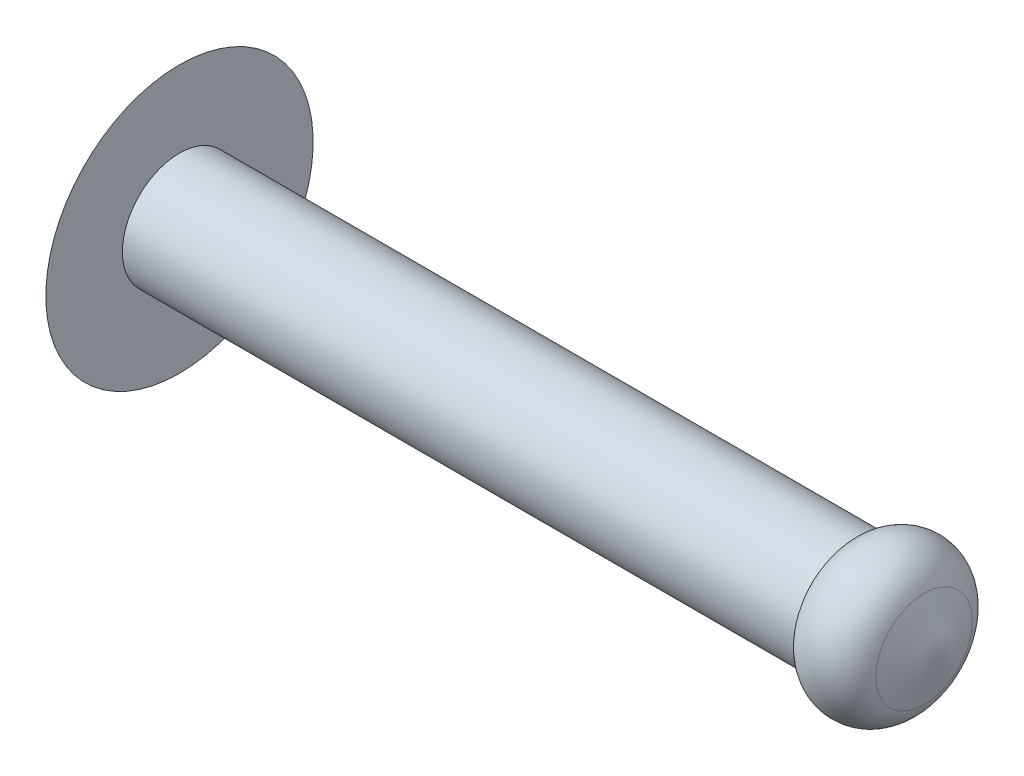
ISO-10303-21;
HEADER;
FILE_DESCRIPTION(('STEP AP214'),'2;1');
FILE_NAME('part.step','',(''),(''),'','','');
FILE_SCHEMA(('AUTOMOTIVE_DESIGN { 1 0 10303 214 1 1 1 1 }'));
ENDSEC;
DATA;
#1=APPLICATION_CONTEXT('core data for automotive mechanical design processes');
#2=APPLICATION_PROTOCOL_DEFINITION('international standard','automotive_design',2000,#1);
#3=PRODUCT_CONTEXT('',#1,'mechanical');
#4=PRODUCT('Part','Part','',(#3));
#5=PRODUCT_RELATED_PRODUCT_CATEGORY('part','',(#4));
#6=PRODUCT_DEFINITION_FORMATION('','',#4);
#7=PRODUCT_DEFINITION_CONTEXT('part definition',#1,'design');
#8=PRODUCT_DEFINITION('design','',#6,#7);
#9=PRODUCT_DEFINITION_SHAPE('','',#8);
#10=(LENGTH_UNIT() NAMED_UNIT(*) SI_UNIT(.MILLI.,.METRE.));
#11=(NAMED_UNIT(*) PLANE_ANGLE_UNIT() SI_UNIT($,.RADIAN.));
#12=(NAMED_UNIT(*) SI_UNIT($,.STERADIAN.) SOLID_ANGLE_UNIT());
#13=UNCERTAINTY_MEASURE_WITH_UNIT(LENGTH_MEASURE(1.E-05),#10,'distance_accuracy_value','');
#14=(GEOMETRIC_REPRESENTATION_CONTEXT(3) GLOBAL_UNCERTAINTY_ASSIGNED_CONTEXT((#13)) GLOBAL_UNIT_ASSIGNED_CONTEXT((#10,
#11,#12)) REPRESENTATION_CONTEXT('',''));
#15=CARTESIAN_POINT('',(0.,0.,0.));
#16=DIRECTION('',(0.,0.,1.));
#17=DIRECTION('',(1.,0.,0.));
#18=AXIS2_PLACEMENT_3D('',#15,#16,#17);
#19=CARTESIAN_POINT('',(15.,0.,0.));
#20=DIRECTION('',(-1.,0.,0.));
#21=DIRECTION('',(0.,-1.,0.));
#22=AXIS2_PLACEMENT_3D('',#19,#20,#21);
#23=CONICAL_SURFACE('',#22,0.,1.24117191937415);
#24=CARTESIAN_POINT('',(14.35,0.,0.));
#25=DIRECTION('',(1.,0.,0.));
#26=DIRECTION('',(0.,1.,0.));
#27=AXIS2_PLACEMENT_3D('',#24,#25,#26);
#28=CIRCLE('',#27,1.9);
#29=CARTESIAN_POINT('',(14.35,1.9,0.));
#30=VERTEX_POINT('',#29);
#31=EDGE_CURVE('E11',#30,#30,#28,.T.);
#32=ORIENTED_EDGE('',*,*,#31,.T.);
#33=EDGE_LOOP('',(#32));
#34=FACE_BOUND('',#33,.T.);
#35=CARTESIAN_POINT('',(15.,0.,0.));
#36=VERTEX_POINT('',#35);
#37=VERTEX_LOOP('',#36);
#38=FACE_BOUND('',#37,.T.);
#39=ADVANCED_FACE('F39',(#34,#38),#23,.T.);
#40=CARTESIAN_POINT('',(12.8400722891566,0.,0.));
#41=DIRECTION('',(1.,0.,0.));
#42=DIRECTION('',(0.,1.,0.));
#43=AXIS2_PLACEMENT_3D('',#40,#41,#42);
#44=DEGENERATE_TOROIDAL_SURFACE('',#43,1.38344578313253,1.5958414554511,.T.);
#45=CARTESIAN_POINT('',(11.5,0.,0.));
#46=DIRECTION('',(1.,0.,0.));
#47=DIRECTION('',(0.,1.,0.));
#48=AXIS2_PLACEMENT_3D('',#45,#46,#47);
#49=CIRCLE('',#48,2.25);
#50=CARTESIAN_POINT('',(11.5,2.25,0.));
#51=VERTEX_POINT('',#50);
#52=EDGE_CURVE('E45',#51,#51,#49,.T.);
#53=ORIENTED_EDGE('',*,*,#52,.T.);
#54=EDGE_LOOP('',(#53));
#55=FACE_BOUND('',#54,.T.);
#56=ORIENTED_EDGE('',*,*,#31,.F.);
#57=EDGE_LOOP('',(#56));
#58=FACE_BOUND('',#57,.T.);
#59=ADVANCED_FACE('F49',(#55,#58),#44,.T.);
#60=CARTESIAN_POINT('',(15.,0.,0.));
#61=DIRECTION('',(1.,0.,0.));
#62=DIRECTION('',(0.,1.,0.));
#63=AXIS2_PLACEMENT_3D('',#60,#61,#62);
#64=CYLINDRICAL_SURFACE('',#63,2.25);
#65=CARTESIAN_POINT('',(-15.,0.,0.));
#66=DIRECTION('',(1.,0.,0.));
#67=DIRECTION('',(0.,1.,0.));
#68=AXIS2_PLACEMENT_3D('',#65,#66,#67);
#69=CIRCLE('',#68,2.25);
#70=CARTESIAN_POINT('',(-15.,2.25,0.));
#71=VERTEX_POINT('',#70);
#72=EDGE_CURVE('E77',#71,#71,#69,.T.);
#73=ORIENTED_EDGE('',*,*,#72,.T.);
#74=EDGE_LOOP('',(#73));
#75=FACE_BOUND('',#74,.T.);
#76=ORIENTED_EDGE('',*,*,#52,.F.);
#77=EDGE_LOOP('',(#76));
#78=FACE_BOUND('',#77,.T.);
#79=ADVANCED_FACE('F54',(#75,#78),#64,.T.);
#80=CARTESIAN_POINT('',(-15.,2.25,0.));
#81=DIRECTION('',(1.,0.,0.));
#82=DIRECTION('',(0.,1.,0.));
#83=AXIS2_PLACEMENT_3D('',#80,#81,#82);
#84=PLANE('',#83);
#85=CARTESIAN_POINT('',(-15.,0.,0.));
#86=DIRECTION('',(1.,0.,0.));
#87=DIRECTION('',(0.,1.,0.));
#88=AXIS2_PLACEMENT_3D('',#85,#86,#87);
#89=CIRCLE('',#88,5.26782687642637);
#90=CARTESIAN_POINT('',(-15.,5.26782687642637,0.));
#91=VERTEX_POINT('',#90);
#92=EDGE_CURVE('E76',#91,#91,#89,.T.);
#93=ORIENTED_EDGE('',*,*,#92,.T.);
#94=EDGE_LOOP('',(#93));
#95=FACE_BOUND('',#94,.T.);
#96=ORIENTED_EDGE('',*,*,#72,.F.);
#97=EDGE_LOOP('',(#96));
#98=FACE_BOUND('',#97,.T.);
#99=ADVANCED_FACE('F61',(#95,#98),#84,.T.);
#100=CARTESIAN_POINT('',(-6.5,0.,0.));
#101=DIRECTION('',(1.,0.,0.));
#102=DIRECTION('',(0.,1.,0.));
#103=AXIS2_PLACEMENT_3D('',#100,#101,#102);
#104=SPHERICAL_SURFACE('',#103,10.);
#105=ORIENTED_EDGE('',*,*,#92,.F.);
#106=EDGE_LOOP('',(#105));
#107=FACE_BOUND('',#106,.T.);
#108=ADVANCED_FACE('F68',(#107),#104,.T.);
#109=CLOSED_SHELL('',(#39,#59,#79,#99,#108));
#110=MANIFOLD_SOLID_BREP('B2',#109);
#111=ADVANCED_BREP_SHAPE_REPRESENTATION('',(#18,#110),#14);
#112=SHAPE_DEFINITION_REPRESENTATION(#9,#111);
ENDSEC;
END-ISO-10303-21;
